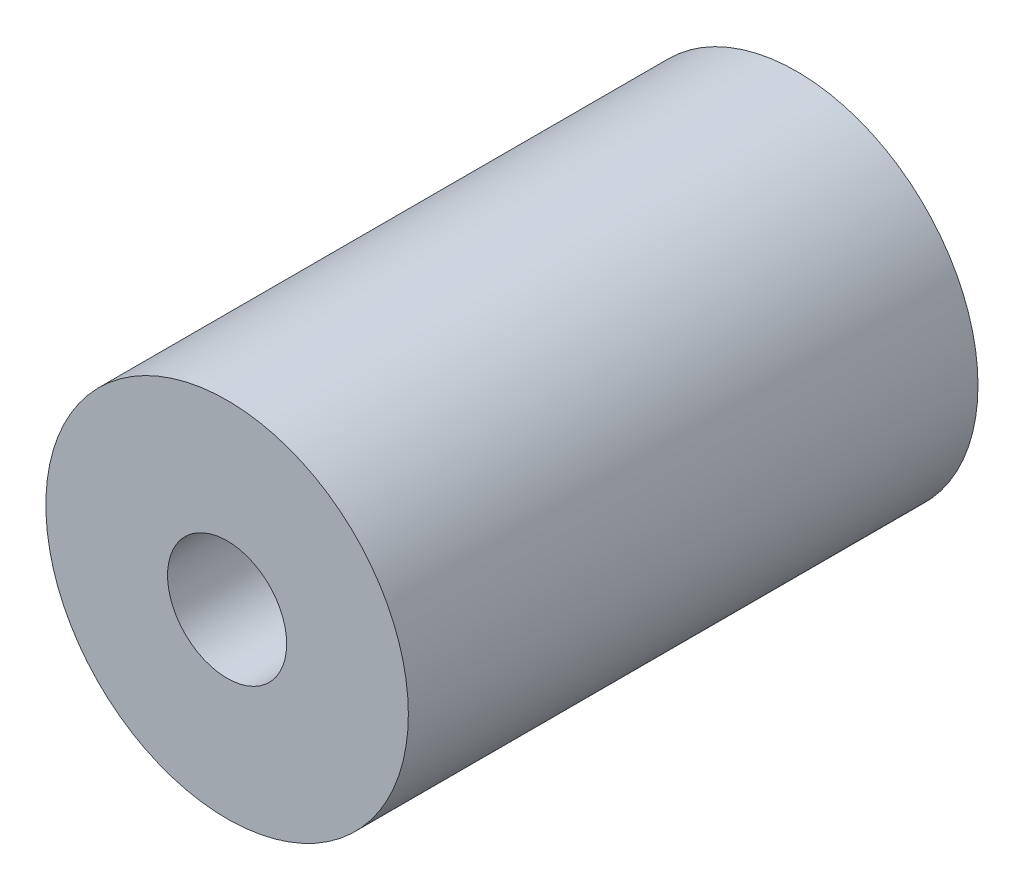
ISO-10303-21;
HEADER;
FILE_DESCRIPTION(('STEP AP214'),'2;1');
FILE_NAME('part.step','',(''),(''),'','','');
FILE_SCHEMA(('AUTOMOTIVE_DESIGN { 1 0 10303 214 1 1 1 1 }'));
ENDSEC;
DATA;
#1=APPLICATION_CONTEXT('core data for automotive mechanical design processes');
#2=APPLICATION_PROTOCOL_DEFINITION('international standard','automotive_design',2000,#1);
#3=PRODUCT_CONTEXT('',#1,'mechanical');
#4=PRODUCT('Part','Part','',(#3));
#5=PRODUCT_RELATED_PRODUCT_CATEGORY('part','',(#4));
#6=PRODUCT_DEFINITION_FORMATION('','',#4);
#7=PRODUCT_DEFINITION_CONTEXT('part definition',#1,'design');
#8=PRODUCT_DEFINITION('design','',#6,#7);
#9=PRODUCT_DEFINITION_SHAPE('','',#8);
#10=(LENGTH_UNIT() NAMED_UNIT(*) SI_UNIT(.MILLI.,.METRE.));
#11=(NAMED_UNIT(*) PLANE_ANGLE_UNIT() SI_UNIT($,.RADIAN.));
#12=(NAMED_UNIT(*) SI_UNIT($,.STERADIAN.) SOLID_ANGLE_UNIT());
#13=UNCERTAINTY_MEASURE_WITH_UNIT(LENGTH_MEASURE(1.E-05),#10,'distance_accuracy_value','');
#14=(GEOMETRIC_REPRESENTATION_CONTEXT(3) GLOBAL_UNCERTAINTY_ASSIGNED_CONTEXT((#13)) GLOBAL_UNIT_ASSIGNED_CONTEXT((#10,
#11,#12)) REPRESENTATION_CONTEXT('',''));
#15=CARTESIAN_POINT('',(0.,0.,0.));
#16=DIRECTION('',(0.,0.,1.));
#17=DIRECTION('',(1.,0.,0.));
#18=AXIS2_PLACEMENT_3D('',#15,#16,#17);
#19=CARTESIAN_POINT('',(0.,0.,11.));
#20=DIRECTION('',(0.,0.,-1.));
#21=DIRECTION('',(-1.,0.,0.));
#22=AXIS2_PLACEMENT_3D('',#19,#20,#21);
#23=CYLINDRICAL_SURFACE('',#22,3.5);
#24=CARTESIAN_POINT('',(0.,0.,11.));
#25=DIRECTION('',(0.,0.,1.));
#26=DIRECTION('',(1.,0.,0.));
#27=AXIS2_PLACEMENT_3D('',#24,#25,#26);
#28=CIRCLE('',#27,3.5);
#29=CARTESIAN_POINT('',(3.5,0.,11.));
#30=VERTEX_POINT('',#29);
#31=EDGE_CURVE('E11',#30,#30,#28,.T.);
#32=ORIENTED_EDGE('',*,*,#31,.F.);
#33=EDGE_LOOP('',(#32));
#34=FACE_BOUND('',#33,.T.);
#35=CARTESIAN_POINT('',(0.,0.,0.));
#36=DIRECTION('',(0.,0.,1.));
#37=DIRECTION('',(1.,0.,0.));
#38=AXIS2_PLACEMENT_3D('',#35,#36,#37);
#39=CIRCLE('',#38,3.5);
#40=CARTESIAN_POINT('',(3.5,0.,0.));
#41=VERTEX_POINT('',#40);
#42=EDGE_CURVE('E40',#41,#41,#39,.T.);
#43=ORIENTED_EDGE('',*,*,#42,.T.);
#44=EDGE_LOOP('',(#43));
#45=FACE_BOUND('',#44,.T.);
#46=ADVANCED_FACE('F37',(#34,#45),#23,.T.);
#47=CARTESIAN_POINT('',(0.,0.,11.));
#48=DIRECTION('',(0.,0.,1.));
#49=DIRECTION('',(1.,0.,0.));
#50=AXIS2_PLACEMENT_3D('',#47,#48,#49);
#51=PLANE('',#50);
#52=CARTESIAN_POINT('',(0.,0.,11.));
#53=DIRECTION('',(0.,0.,1.));
#54=DIRECTION('',(1.,0.,0.));
#55=AXIS2_PLACEMENT_3D('',#52,#53,#54);
#56=CIRCLE('',#55,1.15);
#57=CARTESIAN_POINT('',(1.15,0.,11.));
#58=VERTEX_POINT('',#57);
#59=EDGE_CURVE('E155',#58,#58,#56,.T.);
#60=ORIENTED_EDGE('',*,*,#59,.F.);
#61=EDGE_LOOP('',(#60));
#62=FACE_BOUND('',#61,.T.);
#63=ORIENTED_EDGE('',*,*,#31,.T.);
#64=EDGE_LOOP('',(#63));
#65=FACE_BOUND('',#64,.T.);
#66=ADVANCED_FACE('F169',(#62,#65),#51,.T.);
#67=CARTESIAN_POINT('',(0.,0.,0.));
#68=DIRECTION('',(0.,0.,1.));
#69=DIRECTION('',(1.,0.,0.));
#70=AXIS2_PLACEMENT_3D('',#67,#68,#69);
#71=PLANE('',#70);
#72=DIRECTION('',(0.999999991960229,-0.000126805133793296,0.));
#73=VECTOR('',#72,1.);
#74=CARTESIAN_POINT('',(-1.54965955649005,2.68487527810494,0.));
#75=LINE('',#74,#73);
#76=CARTESIAN_POINT('',(-1.54965955649005,2.68487527810494,0.));
#77=VERTEX_POINT('',#76);
#78=CARTESIAN_POINT('',(1.55034041858666,2.68448218219018,0.));
#79=VERTEX_POINT('',#78);
#80=EDGE_CURVE('E125',#77,#79,#75,.T.);
#81=ORIENTED_EDGE('',*,*,#80,.F.);
#82=DIRECTION('',(0.50010981244731,0.865961994254896,0.));
#83=VECTOR('',#82,1.);
#84=CARTESIAN_POINT('',(-3.09999997507671,0.000393095914759962,0.));
#85=LINE('',#84,#83);
#86=CARTESIAN_POINT('',(-3.09999997507671,0.000393095914759962,0.));
#87=VERTEX_POINT('',#86);
#88=EDGE_CURVE('E51',#87,#77,#85,.T.);
#89=ORIENTED_EDGE('',*,*,#88,.F.);
#90=DIRECTION('',(-0.499890179512919,0.866088799388689,0.));
#91=VECTOR('',#90,1.);
#92=CARTESIAN_POINT('',(-1.55034041858666,-2.68448218219018,0.));
#93=LINE('',#92,#91);
#94=CARTESIAN_POINT('',(-1.55034041858666,-2.68448218219018,0.));
#95=VERTEX_POINT('',#94);
#96=EDGE_CURVE('E135',#95,#87,#93,.T.);
#97=ORIENTED_EDGE('',*,*,#96,.F.);
#98=DIRECTION('',(-0.999999991960229,0.000126805133793435,0.));
#99=VECTOR('',#98,1.);
#100=CARTESIAN_POINT('',(1.54965955649005,-2.68487527810494,0.));
#101=LINE('',#100,#99);
#102=CARTESIAN_POINT('',(1.54965955649005,-2.68487527810494,0.));
#103=VERTEX_POINT('',#102);
#104=EDGE_CURVE('E133',#103,#95,#101,.T.);
#105=ORIENTED_EDGE('',*,*,#104,.F.);
#106=DIRECTION('',(-0.50010981244731,-0.865961994254896,0.));
#107=VECTOR('',#106,1.);
#108=CARTESIAN_POINT('',(3.09999997507671,-0.000393095914760302,0.));
#109=LINE('',#108,#107);
#110=CARTESIAN_POINT('',(3.09999997507671,-0.000393095914760302,0.));
#111=VERTEX_POINT('',#110);
#112=EDGE_CURVE('E99',#111,#103,#109,.T.);
#113=ORIENTED_EDGE('',*,*,#112,.F.);
#114=DIRECTION('',(0.499890179512919,-0.86608879938869,0.));
#115=VECTOR('',#114,1.);
#116=CARTESIAN_POINT('',(1.55034041858666,2.68448218219018,0.));
#117=LINE('',#116,#115);
#118=EDGE_CURVE('E129',#79,#111,#117,.T.);
#119=ORIENTED_EDGE('',*,*,#118,.F.);
#120=EDGE_LOOP('',(#81,#89,#97,#105,#113,#119));
#121=FACE_BOUND('',#120,.T.);
#122=ORIENTED_EDGE('',*,*,#42,.F.);
#123=EDGE_LOOP('',(#122));
#124=FACE_BOUND('',#123,.T.);
#125=ADVANCED_FACE('F148',(#121,#124),#71,.F.);
#126=CARTESIAN_POINT('',(-3.09999997507671,0.000393095914759962,7.));
#127=DIRECTION('',(-0.865961994254896,0.50010981244731,0.));
#128=DIRECTION('',(-0.50010981244731,-0.865961994254896,0.));
#129=AXIS2_PLACEMENT_3D('',#126,#127,#128);
#130=PLANE('',#129);
#131=ORIENTED_EDGE('',*,*,#88,.T.);
#132=DIRECTION('',(0.,0.,-1.));
#133=VECTOR('',#132,1.);
#134=CARTESIAN_POINT('',(-1.54965955649005,2.68487527810494,7.));
#135=LINE('',#134,#133);
#136=CARTESIAN_POINT('',(-1.54965955649005,2.68487527810494,7.));
#137=VERTEX_POINT('',#136);
#138=EDGE_CURVE('E81',#137,#77,#135,.T.);
#139=ORIENTED_EDGE('',*,*,#138,.F.);
#140=DIRECTION('',(0.50010981244731,0.865961994254896,0.));
#141=VECTOR('',#140,1.);
#142=CARTESIAN_POINT('',(-3.09999997507671,0.000393095914759962,7.));
#143=LINE('',#142,#141);
#144=CARTESIAN_POINT('',(-3.09999997507671,0.000393095914759962,7.));
#145=VERTEX_POINT('',#144);
#146=EDGE_CURVE('E137',#145,#137,#143,.T.);
#147=ORIENTED_EDGE('',*,*,#146,.F.);
#148=DIRECTION('',(0.,0.,-1.));
#149=VECTOR('',#148,1.);
#150=CARTESIAN_POINT('',(-3.09999997507671,0.000393095914759962,7.));
#151=LINE('',#150,#149);
#152=EDGE_CURVE('E59',#145,#87,#151,.T.);
#153=ORIENTED_EDGE('',*,*,#152,.T.);
#154=EDGE_LOOP('',(#131,#139,#147,#153));
#155=FACE_BOUND('',#154,.T.);
#156=ADVANCED_FACE('F180',(#155),#130,.F.);
#157=CARTESIAN_POINT('',(-1.55034041858666,-2.68448218219018,7.));
#158=DIRECTION('',(-0.866088799388689,-0.499890179512919,0.));
#159=DIRECTION('',(0.499890179512919,-0.86608879938869,0.));
#160=AXIS2_PLACEMENT_3D('',#157,#158,#159);
#161=PLANE('',#160);
#162=ORIENTED_EDGE('',*,*,#96,.T.);
#163=ORIENTED_EDGE('',*,*,#152,.F.);
#164=DIRECTION('',(-0.499890179512919,0.866088799388689,0.));
#165=VECTOR('',#164,1.);
#166=CARTESIAN_POINT('',(-1.55034041858666,-2.68448218219018,7.));
#167=LINE('',#166,#165);
#168=CARTESIAN_POINT('',(-1.55034041858666,-2.68448218219018,7.));
#169=VERTEX_POINT('',#168);
#170=EDGE_CURVE('E111',#169,#145,#167,.T.);
#171=ORIENTED_EDGE('',*,*,#170,.F.);
#172=DIRECTION('',(0.,0.,-1.));
#173=VECTOR('',#172,1.);
#174=CARTESIAN_POINT('',(-1.55034041858666,-2.68448218219018,7.));
#175=LINE('',#174,#173);
#176=EDGE_CURVE('E103',#169,#95,#175,.T.);
#177=ORIENTED_EDGE('',*,*,#176,.T.);
#178=EDGE_LOOP('',(#162,#163,#171,#177));
#179=FACE_BOUND('',#178,.T.);
#180=ADVANCED_FACE('F184',(#179),#161,.F.);
#181=CARTESIAN_POINT('',(1.54965955649005,-2.68487527810494,7.));
#182=DIRECTION('',(-0.000126805133793435,-0.999999991960229,0.));
#183=DIRECTION('',(0.999999991960229,-0.000126805133793435,0.));
#184=AXIS2_PLACEMENT_3D('',#181,#182,#183);
#185=PLANE('',#184);
#186=ORIENTED_EDGE('',*,*,#104,.T.);
#187=ORIENTED_EDGE('',*,*,#176,.F.);
#188=DIRECTION('',(-0.999999991960229,0.000126805133793435,0.));
#189=VECTOR('',#188,1.);
#190=CARTESIAN_POINT('',(1.54965955649005,-2.68487527810494,7.));
#191=LINE('',#190,#189);
#192=CARTESIAN_POINT('',(1.54965955649005,-2.68487527810494,7.));
#193=VERTEX_POINT('',#192);
#194=EDGE_CURVE('E107',#193,#169,#191,.T.);
#195=ORIENTED_EDGE('',*,*,#194,.F.);
#196=DIRECTION('',(0.,0.,-1.));
#197=VECTOR('',#196,1.);
#198=CARTESIAN_POINT('',(1.54965955649005,-2.68487527810494,7.));
#199=LINE('',#198,#197);
#200=EDGE_CURVE('E92',#193,#103,#199,.T.);
#201=ORIENTED_EDGE('',*,*,#200,.T.);
#202=EDGE_LOOP('',(#186,#187,#195,#201));
#203=FACE_BOUND('',#202,.T.);
#204=ADVANCED_FACE('F108',(#203),#185,.F.);
#205=CARTESIAN_POINT('',(3.09999997507671,-0.000393095914760302,7.));
#206=DIRECTION('',(0.865961994254896,-0.50010981244731,0.));
#207=DIRECTION('',(0.50010981244731,0.865961994254896,0.));
#208=AXIS2_PLACEMENT_3D('',#205,#206,#207);
#209=PLANE('',#208);
#210=ORIENTED_EDGE('',*,*,#112,.T.);
#211=ORIENTED_EDGE('',*,*,#200,.F.);
#212=DIRECTION('',(-0.50010981244731,-0.865961994254896,0.));
#213=VECTOR('',#212,1.);
#214=CARTESIAN_POINT('',(3.09999997507671,-0.000393095914760302,7.));
#215=LINE('',#214,#213);
#216=CARTESIAN_POINT('',(3.09999997507671,-0.000393095914760302,7.));
#217=VERTEX_POINT('',#216);
#218=EDGE_CURVE('E96',#217,#193,#215,.T.);
#219=ORIENTED_EDGE('',*,*,#218,.F.);
#220=DIRECTION('',(0.,0.,-1.));
#221=VECTOR('',#220,1.);
#222=CARTESIAN_POINT('',(3.09999997507671,-0.000393095914760302,7.));
#223=LINE('',#222,#221);
#224=EDGE_CURVE('E104',#217,#111,#223,.T.);
#225=ORIENTED_EDGE('',*,*,#224,.T.);
#226=EDGE_LOOP('',(#210,#211,#219,#225));
#227=FACE_BOUND('',#226,.T.);
#228=ADVANCED_FACE('F94',(#227),#209,.F.);
#229=CARTESIAN_POINT('',(1.55034041858666,2.68448218219018,7.));
#230=DIRECTION('',(0.86608879938869,0.499890179512919,0.));
#231=DIRECTION('',(-0.499890179512919,0.86608879938869,0.));
#232=AXIS2_PLACEMENT_3D('',#229,#230,#231);
#233=PLANE('',#232);
#234=ORIENTED_EDGE('',*,*,#118,.T.);
#235=ORIENTED_EDGE('',*,*,#224,.F.);
#236=DIRECTION('',(0.499890179512919,-0.86608879938869,0.));
#237=VECTOR('',#236,1.);
#238=CARTESIAN_POINT('',(1.55034041858666,2.68448218219018,7.));
#239=LINE('',#238,#237);
#240=CARTESIAN_POINT('',(1.55034041858666,2.68448218219018,7.));
#241=VERTEX_POINT('',#240);
#242=EDGE_CURVE('E117',#241,#217,#239,.T.);
#243=ORIENTED_EDGE('',*,*,#242,.F.);
#244=DIRECTION('',(0.,0.,-1.));
#245=VECTOR('',#244,1.);
#246=CARTESIAN_POINT('',(1.55034041858666,2.68448218219018,7.));
#247=LINE('',#246,#245);
#248=EDGE_CURVE('E141',#241,#79,#247,.T.);
#249=ORIENTED_EDGE('',*,*,#248,.T.);
#250=EDGE_LOOP('',(#234,#235,#243,#249));
#251=FACE_BOUND('',#250,.T.);
#252=ADVANCED_FACE('F152',(#251),#233,.F.);
#253=CARTESIAN_POINT('',(-1.54965955649005,2.68487527810494,7.));
#254=DIRECTION('',(0.000126805133793296,0.999999991960229,0.));
#255=DIRECTION('',(-0.999999991960229,0.000126805133793296,0.));
#256=AXIS2_PLACEMENT_3D('',#253,#254,#255);
#257=PLANE('',#256);
#258=ORIENTED_EDGE('',*,*,#80,.T.);
#259=ORIENTED_EDGE('',*,*,#248,.F.);
#260=DIRECTION('',(0.999999991960229,-0.000126805133793296,0.));
#261=VECTOR('',#260,1.);
#262=CARTESIAN_POINT('',(-1.54965955649005,2.68487527810494,7.));
#263=LINE('',#262,#261);
#264=EDGE_CURVE('E119',#137,#241,#263,.T.);
#265=ORIENTED_EDGE('',*,*,#264,.F.);
#266=ORIENTED_EDGE('',*,*,#138,.T.);
#267=EDGE_LOOP('',(#258,#259,#265,#266));
#268=FACE_BOUND('',#267,.T.);
#269=ADVANCED_FACE('F145',(#268),#257,.F.);
#270=CARTESIAN_POINT('',(0.,0.,7.));
#271=DIRECTION('',(0.,0.,-1.));
#272=DIRECTION('',(-1.,0.,0.));
#273=AXIS2_PLACEMENT_3D('',#270,#271,#272);
#274=PLANE('',#273);
#275=ORIENTED_EDGE('',*,*,#146,.T.);
#276=ORIENTED_EDGE('',*,*,#264,.T.);
#277=ORIENTED_EDGE('',*,*,#242,.T.);
#278=ORIENTED_EDGE('',*,*,#218,.T.);
#279=ORIENTED_EDGE('',*,*,#194,.T.);
#280=ORIENTED_EDGE('',*,*,#170,.T.);
#281=EDGE_LOOP('',(#275,#276,#277,#278,#279,#280));
#282=FACE_BOUND('',#281,.T.);
#283=ADVANCED_FACE('F114',(#282),#274,.T.);
#284=CARTESIAN_POINT('',(0.,0.,8.7));
#285=DIRECTION('',(0.,0.,1.));
#286=DIRECTION('',(1.,0.,0.));
#287=AXIS2_PLACEMENT_3D('',#284,#285,#286);
#288=CYLINDRICAL_SURFACE('',#287,1.15);
#289=CARTESIAN_POINT('',(0.,0.,8.7));
#290=DIRECTION('',(0.,0.,1.));
#291=DIRECTION('',(1.,0.,0.));
#292=AXIS2_PLACEMENT_3D('',#289,#290,#291);
#293=CIRCLE('',#292,1.15);
#294=CARTESIAN_POINT('',(1.15,0.,8.7));
#295=VERTEX_POINT('',#294);
#296=EDGE_CURVE('E126',#295,#295,#293,.T.);
#297=ORIENTED_EDGE('',*,*,#296,.F.);
#298=EDGE_LOOP('',(#297));
#299=FACE_BOUND('',#298,.T.);
#300=ORIENTED_EDGE('',*,*,#59,.T.);
#301=EDGE_LOOP('',(#300));
#302=FACE_BOUND('',#301,.T.);
#303=ADVANCED_FACE('F163',(#299,#302),#288,.F.);
#304=CARTESIAN_POINT('',(0.,0.,8.7));
#305=DIRECTION('',(0.,0.,1.));
#306=DIRECTION('',(1.,0.,0.));
#307=AXIS2_PLACEMENT_3D('',#304,#305,#306);
#308=PLANE('',#307);
#309=ORIENTED_EDGE('',*,*,#296,.T.);
#310=EDGE_LOOP('',(#309));
#311=FACE_BOUND('',#310,.T.);
#312=ADVANCED_FACE('F161',(#311),#308,.T.);
#313=CLOSED_SHELL('',(#46,#66,#125,#156,#180,#204,#228,#252,#269,#283,#303,#312));
#314=MANIFOLD_SOLID_BREP('B2',#313);
#315=ADVANCED_BREP_SHAPE_REPRESENTATION('',(#18,#314),#14);
#316=SHAPE_DEFINITION_REPRESENTATION(#9,#315);
ENDSEC;
END-ISO-10303-21;
